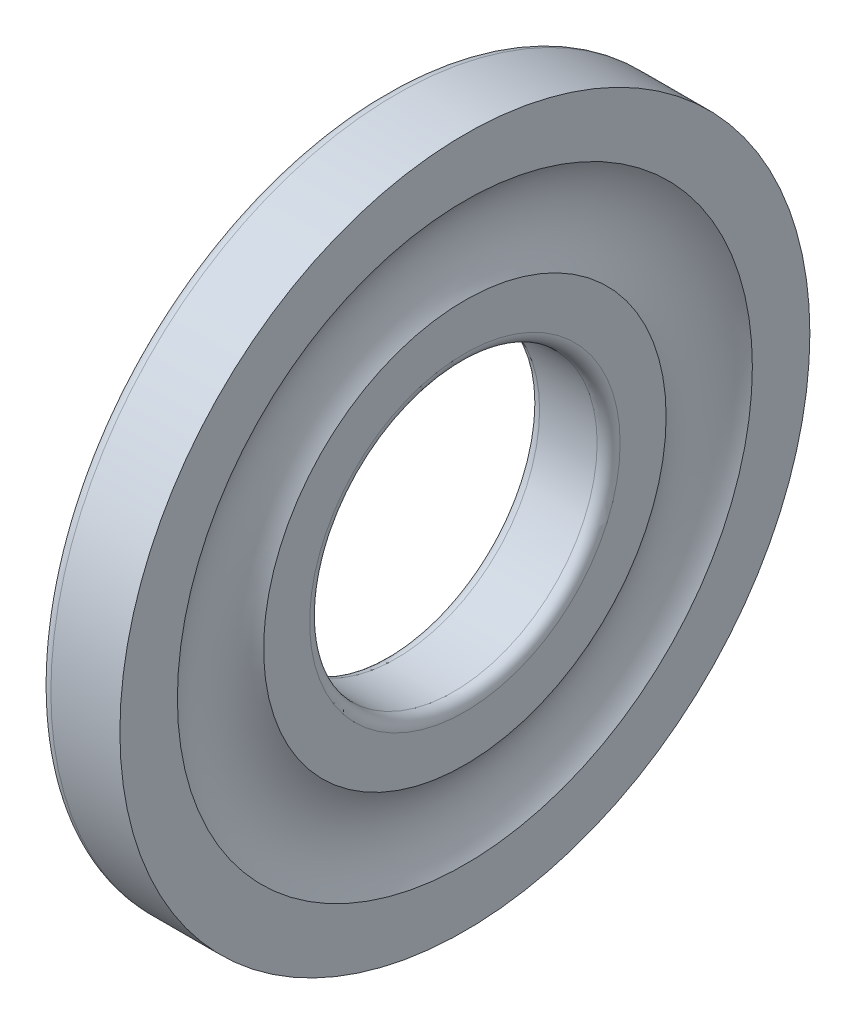
ISO-10303-21;
HEADER;
FILE_DESCRIPTION(('STEP AP214'),'2;1');
FILE_NAME('part.step','',(''),(''),'','','');
FILE_SCHEMA(('AUTOMOTIVE_DESIGN { 1 0 10303 214 1 1 1 1 }'));
ENDSEC;
DATA;
#1=APPLICATION_CONTEXT('core data for automotive mechanical design processes');
#2=APPLICATION_PROTOCOL_DEFINITION('international standard','automotive_design',2000,#1);
#3=PRODUCT_CONTEXT('',#1,'mechanical');
#4=PRODUCT('Part','Part','',(#3));
#5=PRODUCT_RELATED_PRODUCT_CATEGORY('part','',(#4));
#6=PRODUCT_DEFINITION_FORMATION('','',#4);
#7=PRODUCT_DEFINITION_CONTEXT('part definition',#1,'design');
#8=PRODUCT_DEFINITION('design','',#6,#7);
#9=PRODUCT_DEFINITION_SHAPE('','',#8);
#10=(LENGTH_UNIT() NAMED_UNIT(*) SI_UNIT(.MILLI.,.METRE.));
#11=(NAMED_UNIT(*) PLANE_ANGLE_UNIT() SI_UNIT($,.RADIAN.));
#12=(NAMED_UNIT(*) SI_UNIT($,.STERADIAN.) SOLID_ANGLE_UNIT());
#13=UNCERTAINTY_MEASURE_WITH_UNIT(LENGTH_MEASURE(1.E-05),#10,'distance_accuracy_value','');
#14=(GEOMETRIC_REPRESENTATION_CONTEXT(3) GLOBAL_UNCERTAINTY_ASSIGNED_CONTEXT((#13)) GLOBAL_UNIT_ASSIGNED_CONTEXT((#10,
#11,#12)) REPRESENTATION_CONTEXT('',''));
#15=CARTESIAN_POINT('',(0.,0.,0.));
#16=DIRECTION('',(0.,0.,1.));
#17=DIRECTION('',(1.,0.,0.));
#18=AXIS2_PLACEMENT_3D('',#15,#16,#17);
#19=CARTESIAN_POINT('',(7.,13.5,0.));
#20=DIRECTION('',(1.,0.,0.));
#21=DIRECTION('',(0.,0.,-1.));
#22=AXIS2_PLACEMENT_3D('',#19,#20,#21);
#23=PLANE('',#22);
#24=CARTESIAN_POINT('',(7.,0.,0.));
#25=DIRECTION('',(1.,0.,0.));
#26=DIRECTION('',(0.,0.,-1.));
#27=AXIS2_PLACEMENT_3D('',#24,#25,#26);
#28=CIRCLE('',#27,13.5);
#29=CARTESIAN_POINT('',(7.,0.,-13.5));
#30=VERTEX_POINT('',#29);
#31=EDGE_CURVE('E114',#30,#30,#28,.T.);
#32=ORIENTED_EDGE('',*,*,#31,.F.);
#33=EDGE_LOOP('',(#32));
#34=FACE_BOUND('',#33,.T.);
#35=CARTESIAN_POINT('',(7.,0.,0.));
#36=DIRECTION('',(1.,0.,0.));
#37=DIRECTION('',(0.,0.,-1.));
#38=AXIS2_PLACEMENT_3D('',#35,#36,#37);
#39=CIRCLE('',#38,17.5);
#40=CARTESIAN_POINT('',(7.,0.,-17.5));
#41=VERTEX_POINT('',#40);
#42=EDGE_CURVE('E18',#41,#41,#39,.T.);
#43=ORIENTED_EDGE('',*,*,#42,.T.);
#44=EDGE_LOOP('',(#43));
#45=FACE_BOUND('',#44,.T.);
#46=ADVANCED_FACE('F14',(#34,#45),#23,.T.);
#47=CARTESIAN_POINT('',(12.,0.,0.));
#48=DIRECTION('',(1.,0.,0.));
#49=DIRECTION('',(0.,0.,-1.));
#50=AXIS2_PLACEMENT_3D('',#47,#48,#49);
#51=TOROIDAL_SURFACE('',#50,21.25,6.24999999999999);
#52=CARTESIAN_POINT('',(7.,0.,0.));
#53=DIRECTION('',(1.,0.,0.));
#54=DIRECTION('',(0.,0.,-1.));
#55=AXIS2_PLACEMENT_3D('',#52,#53,#54);
#56=CIRCLE('',#55,25.);
#57=CARTESIAN_POINT('',(7.,0.,-25.));
#58=VERTEX_POINT('',#57);
#59=EDGE_CURVE('E85',#58,#58,#56,.F.);
#60=ORIENTED_EDGE('',*,*,#59,.F.);
#61=EDGE_LOOP('',(#60));
#62=FACE_BOUND('',#61,.T.);
#63=ORIENTED_EDGE('',*,*,#42,.F.);
#64=EDGE_LOOP('',(#63));
#65=FACE_BOUND('',#64,.T.);
#66=ADVANCED_FACE('F98',(#62,#65),#51,.F.);
#67=CARTESIAN_POINT('',(6.,0.,0.));
#68=DIRECTION('',(1.,0.,0.));
#69=DIRECTION('',(0.,0.,-1.));
#70=AXIS2_PLACEMENT_3D('',#67,#68,#69);
#71=TOROIDAL_SURFACE('',#70,13.5,0.999999999999999);
#72=CARTESIAN_POINT('',(6.,0.,0.));
#73=DIRECTION('',(-1.,0.,0.));
#74=DIRECTION('',(0.,0.,1.));
#75=AXIS2_PLACEMENT_3D('',#72,#73,#74);
#76=CIRCLE('',#75,12.5);
#77=CARTESIAN_POINT('',(6.,0.,12.5));
#78=VERTEX_POINT('',#77);
#79=EDGE_CURVE('E77',#78,#78,#76,.T.);
#80=ORIENTED_EDGE('',*,*,#79,.T.);
#81=EDGE_LOOP('',(#80));
#82=FACE_BOUND('',#81,.T.);
#83=ORIENTED_EDGE('',*,*,#31,.T.);
#84=EDGE_LOOP('',(#83));
#85=FACE_BOUND('',#84,.T.);
#86=ADVANCED_FACE('F93',(#82,#85),#71,.T.);
#87=CARTESIAN_POINT('',(7.,25.,0.));
#88=DIRECTION('',(1.,0.,0.));
#89=DIRECTION('',(0.,0.,-1.));
#90=AXIS2_PLACEMENT_3D('',#87,#88,#89);
#91=PLANE('',#90);
#92=ORIENTED_EDGE('',*,*,#59,.T.);
#93=EDGE_LOOP('',(#92));
#94=FACE_BOUND('',#93,.T.);
#95=CARTESIAN_POINT('',(7.,0.,0.));
#96=DIRECTION('',(-1.,0.,0.));
#97=DIRECTION('',(0.,0.,1.));
#98=AXIS2_PLACEMENT_3D('',#95,#96,#97);
#99=CIRCLE('',#98,30.);
#100=CARTESIAN_POINT('',(7.,0.,30.));
#101=VERTEX_POINT('',#100);
#102=EDGE_CURVE('E37',#101,#101,#99,.T.);
#103=ORIENTED_EDGE('',*,*,#102,.F.);
#104=EDGE_LOOP('',(#103));
#105=FACE_BOUND('',#104,.T.);
#106=ADVANCED_FACE('F97',(#94,#105),#91,.T.);
#107=CARTESIAN_POINT('',(7.,0.,0.));
#108=DIRECTION('',(-1.,0.,0.));
#109=DIRECTION('',(0.,0.,1.));
#110=AXIS2_PLACEMENT_3D('',#107,#108,#109);
#111=CYLINDRICAL_SURFACE('',#110,12.5);
#112=CARTESIAN_POINT('',(1.,0.,0.));
#113=DIRECTION('',(1.,0.,0.));
#114=DIRECTION('',(0.,0.,-1.));
#115=AXIS2_PLACEMENT_3D('',#112,#113,#114);
#116=CIRCLE('',#115,12.5);
#117=CARTESIAN_POINT('',(1.,0.,-12.5));
#118=VERTEX_POINT('',#117);
#119=EDGE_CURVE('E32',#118,#118,#116,.T.);
#120=ORIENTED_EDGE('',*,*,#119,.F.);
#121=EDGE_LOOP('',(#120));
#122=FACE_BOUND('',#121,.T.);
#123=ORIENTED_EDGE('',*,*,#79,.F.);
#124=EDGE_LOOP('',(#123));
#125=FACE_BOUND('',#124,.T.);
#126=ADVANCED_FACE('F149',(#122,#125),#111,.F.);
#127=CARTESIAN_POINT('',(7.,0.,0.));
#128=DIRECTION('',(-1.,0.,0.));
#129=DIRECTION('',(0.,0.,1.));
#130=AXIS2_PLACEMENT_3D('',#127,#128,#129);
#131=CYLINDRICAL_SURFACE('',#130,30.);
#132=ORIENTED_EDGE('',*,*,#102,.T.);
#133=EDGE_LOOP('',(#132));
#134=FACE_BOUND('',#133,.T.);
#135=CARTESIAN_POINT('',(0.999999999999998,0.,0.));
#136=DIRECTION('',(1.,0.,0.));
#137=DIRECTION('',(0.,0.,-1.));
#138=AXIS2_PLACEMENT_3D('',#135,#136,#137);
#139=CIRCLE('',#138,30.);
#140=CARTESIAN_POINT('',(0.999999999999998,0.,-30.));
#141=VERTEX_POINT('',#140);
#142=EDGE_CURVE('E27',#141,#141,#139,.F.);
#143=ORIENTED_EDGE('',*,*,#142,.F.);
#144=EDGE_LOOP('',(#143));
#145=FACE_BOUND('',#144,.T.);
#146=ADVANCED_FACE('F68',(#134,#145),#131,.T.);
#147=CARTESIAN_POINT('',(1.,0.,0.));
#148=DIRECTION('',(1.,0.,0.));
#149=DIRECTION('',(0.,0.,-1.));
#150=AXIS2_PLACEMENT_3D('',#147,#148,#149);
#151=TOROIDAL_SURFACE('',#150,13.5,1.);
#152=CARTESIAN_POINT('',(0.,0.,0.));
#153=DIRECTION('',(-1.,0.,0.));
#154=DIRECTION('',(0.,0.,-1.));
#155=AXIS2_PLACEMENT_3D('',#152,#153,#154);
#156=CIRCLE('',#155,13.5);
#157=CARTESIAN_POINT('',(0.,0.,-13.5));
#158=VERTEX_POINT('',#157);
#159=EDGE_CURVE('E22',#158,#158,#156,.F.);
#160=ORIENTED_EDGE('',*,*,#159,.F.);
#161=EDGE_LOOP('',(#160));
#162=FACE_BOUND('',#161,.T.);
#163=ORIENTED_EDGE('',*,*,#119,.T.);
#164=EDGE_LOOP('',(#163));
#165=FACE_BOUND('',#164,.T.);
#166=ADVANCED_FACE('F63',(#162,#165),#151,.T.);
#167=CARTESIAN_POINT('',(0.999999999999998,0.,0.));
#168=DIRECTION('',(1.,0.,0.));
#169=DIRECTION('',(0.,0.,-1.));
#170=AXIS2_PLACEMENT_3D('',#167,#168,#169);
#171=TOROIDAL_SURFACE('',#170,29.,0.999999999999997);
#172=ORIENTED_EDGE('',*,*,#142,.T.);
#173=EDGE_LOOP('',(#172));
#174=FACE_BOUND('',#173,.T.);
#175=CARTESIAN_POINT('',(0.,0.,0.));
#176=DIRECTION('',(1.,0.,0.));
#177=DIRECTION('',(0.,0.,-1.));
#178=AXIS2_PLACEMENT_3D('',#175,#176,#177);
#179=CIRCLE('',#178,29.);
#180=CARTESIAN_POINT('',(0.,0.,-29.));
#181=VERTEX_POINT('',#180);
#182=EDGE_CURVE('E10',#181,#181,#179,.F.);
#183=ORIENTED_EDGE('',*,*,#182,.F.);
#184=EDGE_LOOP('',(#183));
#185=FACE_BOUND('',#184,.T.);
#186=ADVANCED_FACE('F52',(#174,#185),#171,.T.);
#187=CARTESIAN_POINT('',(0.,29.,0.));
#188=DIRECTION('',(-1.,0.,0.));
#189=DIRECTION('',(0.,0.,1.));
#190=AXIS2_PLACEMENT_3D('',#187,#188,#189);
#191=PLANE('',#190);
#192=ORIENTED_EDGE('',*,*,#182,.T.);
#193=EDGE_LOOP('',(#192));
#194=FACE_BOUND('',#193,.T.);
#195=ORIENTED_EDGE('',*,*,#159,.T.);
#196=EDGE_LOOP('',(#195));
#197=FACE_BOUND('',#196,.T.);
#198=ADVANCED_FACE('F62',(#194,#197),#191,.T.);
#199=CLOSED_SHELL('',(#46,#66,#86,#106,#126,#146,#166,#186,#198));
#200=MANIFOLD_SOLID_BREP('B1',#199);
#201=ADVANCED_BREP_SHAPE_REPRESENTATION('',(#18,#200),#14);
#202=SHAPE_DEFINITION_REPRESENTATION(#9,#201);
ENDSEC;
END-ISO-10303-21;
